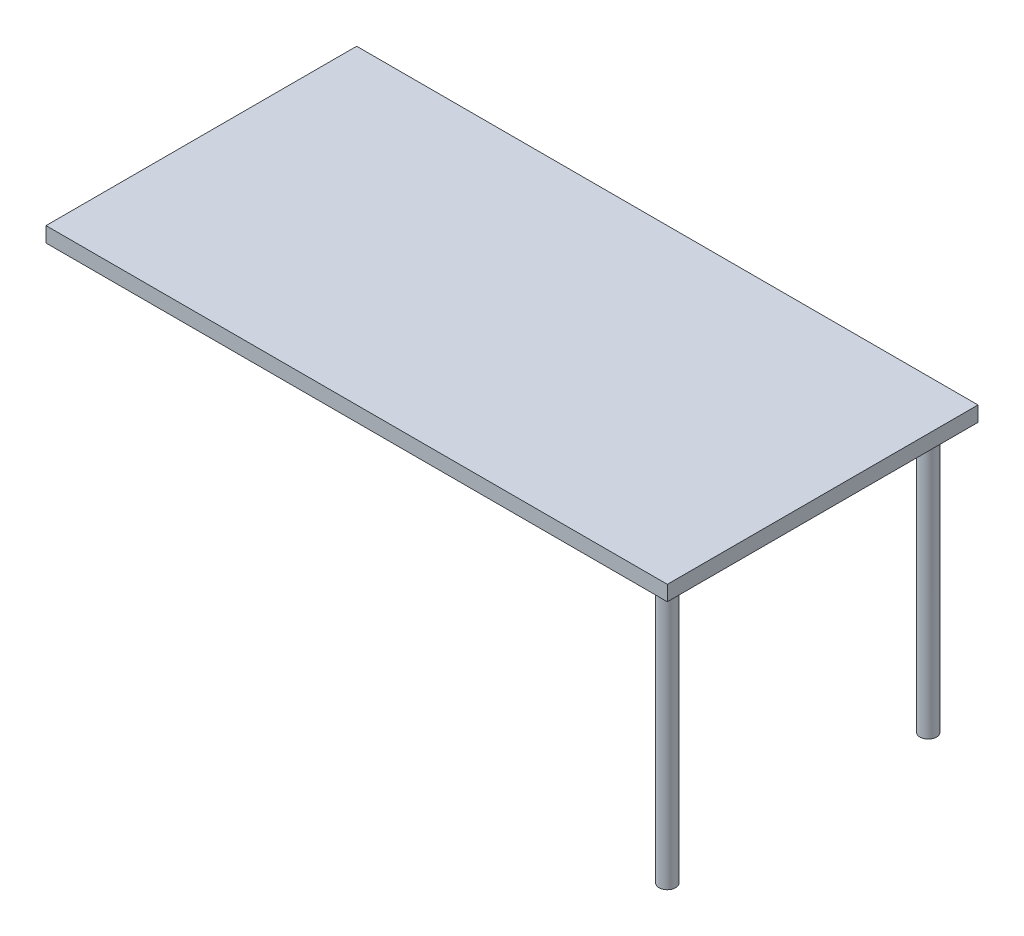
ISO-10303-21;
HEADER;
FILE_DESCRIPTION(('STEP AP214'),'2;1');
FILE_NAME('part.step','',(''),(''),'','','');
FILE_SCHEMA(('AUTOMOTIVE_DESIGN { 1 0 10303 214 1 1 1 1 }'));
ENDSEC;
DATA;
#1=APPLICATION_CONTEXT('core data for automotive mechanical design processes');
#2=APPLICATION_PROTOCOL_DEFINITION('international standard','automotive_design',2000,#1);
#3=PRODUCT_CONTEXT('',#1,'mechanical');
#4=PRODUCT('Part','Part','',(#3));
#5=PRODUCT_RELATED_PRODUCT_CATEGORY('part','',(#4));
#6=PRODUCT_DEFINITION_FORMATION('','',#4);
#7=PRODUCT_DEFINITION_CONTEXT('part definition',#1,'design');
#8=PRODUCT_DEFINITION('design','',#6,#7);
#9=PRODUCT_DEFINITION_SHAPE('','',#8);
#10=(LENGTH_UNIT() NAMED_UNIT(*) SI_UNIT(.MILLI.,.METRE.));
#11=(NAMED_UNIT(*) PLANE_ANGLE_UNIT() SI_UNIT($,.RADIAN.));
#12=(NAMED_UNIT(*) SI_UNIT($,.STERADIAN.) SOLID_ANGLE_UNIT());
#13=UNCERTAINTY_MEASURE_WITH_UNIT(LENGTH_MEASURE(1.E-05),#10,'distance_accuracy_value','');
#14=(GEOMETRIC_REPRESENTATION_CONTEXT(3) GLOBAL_UNCERTAINTY_ASSIGNED_CONTEXT((#13)) GLOBAL_UNIT_ASSIGNED_CONTEXT((#10,
#11,#12)) REPRESENTATION_CONTEXT('',''));
#15=CARTESIAN_POINT('',(0.,0.,0.));
#16=DIRECTION('',(0.,0.,1.));
#17=DIRECTION('',(1.,0.,0.));
#18=AXIS2_PLACEMENT_3D('',#15,#16,#17);
#19=CARTESIAN_POINT('',(750.,36.5,375.));
#20=DIRECTION('',(-1.,0.,0.));
#21=DIRECTION('',(0.,0.,1.));
#22=AXIS2_PLACEMENT_3D('',#19,#20,#21);
#23=PLANE('',#22);
#24=DIRECTION('',(0.,0.,-1.));
#25=VECTOR('',#24,1.);
#26=CARTESIAN_POINT('',(750.,0.,375.));
#27=LINE('',#26,#25);
#28=CARTESIAN_POINT('',(750.,0.,375.));
#29=VERTEX_POINT('',#28);
#30=CARTESIAN_POINT('',(750.,0.,-375.));
#31=VERTEX_POINT('',#30);
#32=EDGE_CURVE('E103',#29,#31,#27,.T.);
#33=ORIENTED_EDGE('',*,*,#32,.T.);
#34=DIRECTION('',(0.,-1.,0.));
#35=VECTOR('',#34,1.);
#36=CARTESIAN_POINT('',(750.,36.5,-375.));
#37=LINE('',#36,#35);
#38=CARTESIAN_POINT('',(750.,36.5,-375.));
#39=VERTEX_POINT('',#38);
#40=EDGE_CURVE('E45',#39,#31,#37,.T.);
#41=ORIENTED_EDGE('',*,*,#40,.F.);
#42=DIRECTION('',(0.,0.,-1.));
#43=VECTOR('',#42,1.);
#44=CARTESIAN_POINT('',(750.,36.5,375.));
#45=LINE('',#44,#43);
#46=CARTESIAN_POINT('',(750.,36.5,375.));
#47=VERTEX_POINT('',#46);
#48=EDGE_CURVE('E89',#47,#39,#45,.T.);
#49=ORIENTED_EDGE('',*,*,#48,.F.);
#50=DIRECTION('',(0.,-1.,0.));
#51=VECTOR('',#50,1.);
#52=CARTESIAN_POINT('',(750.,36.5,375.));
#53=LINE('',#52,#51);
#54=EDGE_CURVE('E99',#47,#29,#53,.T.);
#55=ORIENTED_EDGE('',*,*,#54,.T.);
#56=EDGE_LOOP('',(#33,#41,#49,#55));
#57=FACE_BOUND('',#56,.T.);
#58=ADVANCED_FACE('F37',(#57),#23,.F.);
#59=CARTESIAN_POINT('',(-750.,36.5,-375.));
#60=DIRECTION('',(0.,0.,1.));
#61=DIRECTION('',(1.,0.,0.));
#62=AXIS2_PLACEMENT_3D('',#59,#60,#61);
#63=PLANE('',#62);
#64=DIRECTION('',(-1.,0.,0.));
#65=VECTOR('',#64,1.);
#66=CARTESIAN_POINT('',(-750.,0.,-375.));
#67=LINE('',#66,#65);
#68=CARTESIAN_POINT('',(-750.,0.,-375.));
#69=VERTEX_POINT('',#68);
#70=EDGE_CURVE('E94',#31,#69,#67,.T.);
#71=ORIENTED_EDGE('',*,*,#70,.T.);
#72=DIRECTION('',(0.,-1.,0.));
#73=VECTOR('',#72,1.);
#74=CARTESIAN_POINT('',(-750.,36.5,-375.));
#75=LINE('',#74,#73);
#76=CARTESIAN_POINT('',(-750.,36.5,-375.));
#77=VERTEX_POINT('',#76);
#78=EDGE_CURVE('E92',#77,#69,#75,.T.);
#79=ORIENTED_EDGE('',*,*,#78,.F.);
#80=DIRECTION('',(-1.,0.,0.));
#81=VECTOR('',#80,1.);
#82=CARTESIAN_POINT('',(-750.,36.5,-375.));
#83=LINE('',#82,#81);
#84=EDGE_CURVE('E84',#39,#77,#83,.T.);
#85=ORIENTED_EDGE('',*,*,#84,.F.);
#86=ORIENTED_EDGE('',*,*,#40,.T.);
#87=EDGE_LOOP('',(#71,#79,#85,#86));
#88=FACE_BOUND('',#87,.T.);
#89=ADVANCED_FACE('F93',(#88),#63,.F.);
#90=CARTESIAN_POINT('',(-750.,36.5,375.));
#91=DIRECTION('',(1.,0.,0.));
#92=DIRECTION('',(0.,0.,-1.));
#93=AXIS2_PLACEMENT_3D('',#90,#91,#92);
#94=PLANE('',#93);
#95=DIRECTION('',(0.,0.,1.));
#96=VECTOR('',#95,1.);
#97=CARTESIAN_POINT('',(-750.,0.,375.));
#98=LINE('',#97,#96);
#99=CARTESIAN_POINT('',(-750.,0.,375.));
#100=VERTEX_POINT('',#99);
#101=EDGE_CURVE('E70',#69,#100,#98,.T.);
#102=ORIENTED_EDGE('',*,*,#101,.T.);
#103=DIRECTION('',(0.,-1.,0.));
#104=VECTOR('',#103,1.);
#105=CARTESIAN_POINT('',(-750.,36.5,375.));
#106=LINE('',#105,#104);
#107=CARTESIAN_POINT('',(-750.,36.5,375.));
#108=VERTEX_POINT('',#107);
#109=EDGE_CURVE('E95',#108,#100,#106,.T.);
#110=ORIENTED_EDGE('',*,*,#109,.F.);
#111=DIRECTION('',(0.,0.,1.));
#112=VECTOR('',#111,1.);
#113=CARTESIAN_POINT('',(-750.,36.5,375.));
#114=LINE('',#113,#112);
#115=EDGE_CURVE('E87',#77,#108,#114,.T.);
#116=ORIENTED_EDGE('',*,*,#115,.F.);
#117=ORIENTED_EDGE('',*,*,#78,.T.);
#118=EDGE_LOOP('',(#102,#110,#116,#117));
#119=FACE_BOUND('',#118,.T.);
#120=ADVANCED_FACE('F97',(#119),#94,.F.);
#121=CARTESIAN_POINT('',(-750.,36.5,375.));
#122=DIRECTION('',(0.,0.,-1.));
#123=DIRECTION('',(-1.,0.,0.));
#124=AXIS2_PLACEMENT_3D('',#121,#122,#123);
#125=PLANE('',#124);
#126=DIRECTION('',(1.,0.,0.));
#127=VECTOR('',#126,1.);
#128=CARTESIAN_POINT('',(-750.,0.,375.));
#129=LINE('',#128,#127);
#130=EDGE_CURVE('E76',#100,#29,#129,.T.);
#131=ORIENTED_EDGE('',*,*,#130,.T.);
#132=ORIENTED_EDGE('',*,*,#54,.F.);
#133=DIRECTION('',(1.,0.,0.));
#134=VECTOR('',#133,1.);
#135=CARTESIAN_POINT('',(-750.,36.5,375.));
#136=LINE('',#135,#134);
#137=EDGE_CURVE('E53',#108,#47,#136,.T.);
#138=ORIENTED_EDGE('',*,*,#137,.F.);
#139=ORIENTED_EDGE('',*,*,#109,.T.);
#140=EDGE_LOOP('',(#131,#132,#138,#139));
#141=FACE_BOUND('',#140,.T.);
#142=ADVANCED_FACE('F126',(#141),#125,.F.);
#143=CARTESIAN_POINT('',(0.,36.5,0.));
#144=DIRECTION('',(0.,-1.,0.));
#145=DIRECTION('',(0.,0.,-1.));
#146=AXIS2_PLACEMENT_3D('',#143,#144,#145);
#147=PLANE('',#146);
#148=ORIENTED_EDGE('',*,*,#48,.T.);
#149=ORIENTED_EDGE('',*,*,#84,.T.);
#150=ORIENTED_EDGE('',*,*,#115,.T.);
#151=ORIENTED_EDGE('',*,*,#137,.T.);
#152=EDGE_LOOP('',(#148,#149,#150,#151));
#153=FACE_BOUND('',#152,.T.);
#154=ADVANCED_FACE('F85',(#153),#147,.F.);
#155=CARTESIAN_POINT('',(0.,0.,0.));
#156=DIRECTION('',(0.,-1.,0.));
#157=DIRECTION('',(0.,0.,-1.));
#158=AXIS2_PLACEMENT_3D('',#155,#156,#157);
#159=PLANE('',#158);
#160=CARTESIAN_POINT('',(690.,0.,-315.));
#161=DIRECTION('',(0.,-1.,0.));
#162=DIRECTION('',(0.,0.,-1.));
#163=AXIS2_PLACEMENT_3D('',#160,#161,#162);
#164=CIRCLE('',#163,20.);
#165=CARTESIAN_POINT('',(690.,0.,-335.));
#166=VERTEX_POINT('',#165);
#167=EDGE_CURVE('E11',#166,#166,#164,.T.);
#168=ORIENTED_EDGE('',*,*,#167,.F.);
#169=EDGE_LOOP('',(#168));
#170=FACE_BOUND('',#169,.T.);
#171=CARTESIAN_POINT('',(690.,0.,315.));
#172=DIRECTION('',(0.,-1.,0.));
#173=DIRECTION('',(0.,0.,-1.));
#174=AXIS2_PLACEMENT_3D('',#171,#172,#173);
#175=CIRCLE('',#174,20.);
#176=CARTESIAN_POINT('',(690.,0.,295.));
#177=VERTEX_POINT('',#176);
#178=EDGE_CURVE('E228',#177,#177,#175,.T.);
#179=ORIENTED_EDGE('',*,*,#178,.F.);
#180=EDGE_LOOP('',(#179));
#181=FACE_BOUND('',#180,.T.);
#182=ORIENTED_EDGE('',*,*,#32,.F.);
#183=ORIENTED_EDGE('',*,*,#130,.F.);
#184=ORIENTED_EDGE('',*,*,#101,.F.);
#185=ORIENTED_EDGE('',*,*,#70,.F.);
#186=EDGE_LOOP('',(#182,#183,#184,#185));
#187=FACE_BOUND('',#186,.T.);
#188=ADVANCED_FACE('F114',(#170,#181,#187),#159,.T.);
#189=CARTESIAN_POINT('',(690.,-648.,315.));
#190=DIRECTION('',(0.,1.,0.));
#191=DIRECTION('',(0.,0.,1.));
#192=AXIS2_PLACEMENT_3D('',#189,#190,#191);
#193=CYLINDRICAL_SURFACE('',#192,20.);
#194=CARTESIAN_POINT('',(690.,-648.,315.));
#195=DIRECTION('',(0.,-1.,0.));
#196=DIRECTION('',(0.,0.,-1.));
#197=AXIS2_PLACEMENT_3D('',#194,#195,#196);
#198=CIRCLE('',#197,20.);
#199=CARTESIAN_POINT('',(690.,-648.,295.));
#200=VERTEX_POINT('',#199);
#201=EDGE_CURVE('E106',#200,#200,#198,.T.);
#202=ORIENTED_EDGE('',*,*,#201,.F.);
#203=EDGE_LOOP('',(#202));
#204=FACE_BOUND('',#203,.T.);
#205=ORIENTED_EDGE('',*,*,#178,.T.);
#206=EDGE_LOOP('',(#205));
#207=FACE_BOUND('',#206,.T.);
#208=ADVANCED_FACE('F116',(#204,#207),#193,.T.);
#209=CARTESIAN_POINT('',(690.,-648.,315.));
#210=DIRECTION('',(0.,-1.,0.));
#211=DIRECTION('',(0.,0.,-1.));
#212=AXIS2_PLACEMENT_3D('',#209,#210,#211);
#213=PLANE('',#212);
#214=ORIENTED_EDGE('',*,*,#201,.T.);
#215=EDGE_LOOP('',(#214));
#216=FACE_BOUND('',#215,.T.);
#217=ADVANCED_FACE('F123',(#216),#213,.T.);
#218=CARTESIAN_POINT('',(690.,-648.,-315.));
#219=DIRECTION('',(0.,1.,0.));
#220=DIRECTION('',(0.,0.,1.));
#221=AXIS2_PLACEMENT_3D('',#218,#219,#220);
#222=CYLINDRICAL_SURFACE('',#221,20.);
#223=CARTESIAN_POINT('',(690.,-648.,-315.));
#224=DIRECTION('',(0.,1.,0.));
#225=DIRECTION('',(0.,0.,1.));
#226=AXIS2_PLACEMENT_3D('',#223,#224,#225);
#227=CIRCLE('',#226,20.);
#228=CARTESIAN_POINT('',(690.,-648.,-295.));
#229=VERTEX_POINT('',#228);
#230=EDGE_CURVE('E227',#229,#229,#227,.T.);
#231=ORIENTED_EDGE('',*,*,#230,.T.);
#232=EDGE_LOOP('',(#231));
#233=FACE_BOUND('',#232,.T.);
#234=ORIENTED_EDGE('',*,*,#167,.T.);
#235=EDGE_LOOP('',(#234));
#236=FACE_BOUND('',#235,.T.);
#237=ADVANCED_FACE('F165',(#233,#236),#222,.T.);
#238=CARTESIAN_POINT('',(690.,-648.,-315.));
#239=DIRECTION('',(0.,-1.,0.));
#240=DIRECTION('',(0.,0.,1.));
#241=AXIS2_PLACEMENT_3D('',#238,#239,#240);
#242=PLANE('',#241);
#243=ORIENTED_EDGE('',*,*,#230,.F.);
#244=EDGE_LOOP('',(#243));
#245=FACE_BOUND('',#244,.T.);
#246=ADVANCED_FACE('F181',(#245),#242,.T.);
#247=CLOSED_SHELL('',(#58,#89,#120,#142,#154,#188,#208,#217,#237,#246));
#248=MANIFOLD_SOLID_BREP('B2',#247);
#249=ADVANCED_BREP_SHAPE_REPRESENTATION('',(#18,#248),#14);
#250=SHAPE_DEFINITION_REPRESENTATION(#9,#249);
ENDSEC;
END-ISO-10303-21;
